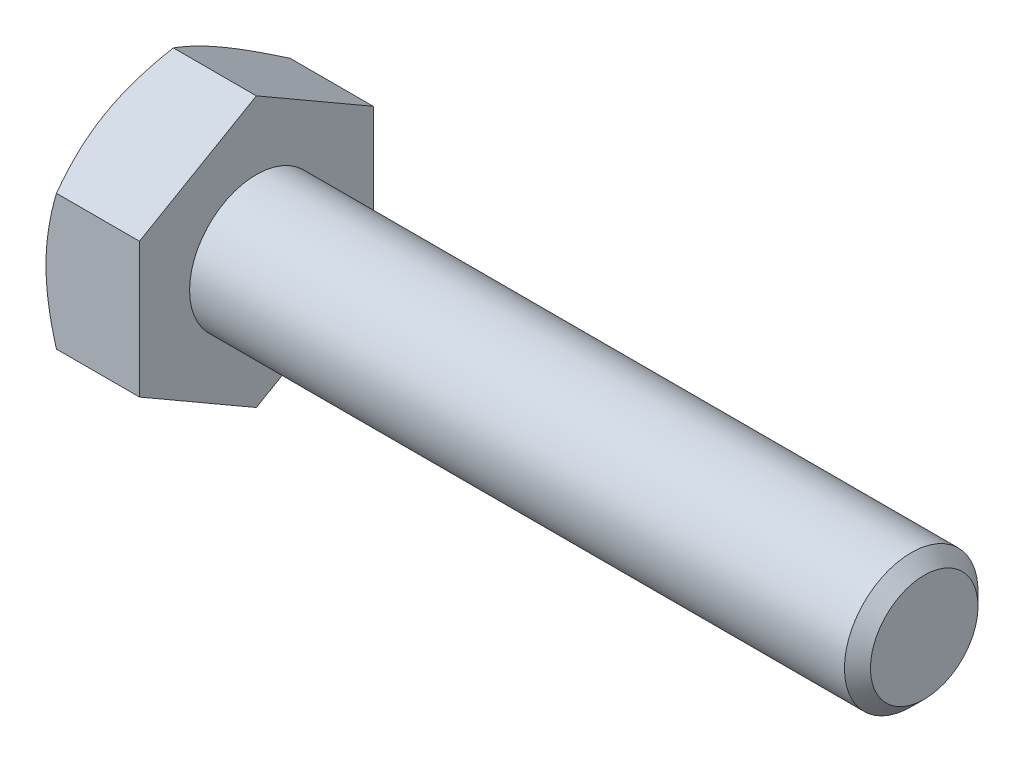
ISO-10303-21;
HEADER;
FILE_DESCRIPTION(('STEP AP214'),'2;1');
FILE_NAME('part.step','',(''),(''),'','','');
FILE_SCHEMA(('AUTOMOTIVE_DESIGN { 1 0 10303 214 1 1 1 1 }'));
ENDSEC;
DATA;
#1=APPLICATION_CONTEXT('core data for automotive mechanical design processes');
#2=APPLICATION_PROTOCOL_DEFINITION('international standard','automotive_design',2000,#1);
#3=PRODUCT_CONTEXT('',#1,'mechanical');
#4=PRODUCT('Part','Part','',(#3));
#5=PRODUCT_RELATED_PRODUCT_CATEGORY('part','',(#4));
#6=PRODUCT_DEFINITION_FORMATION('','',#4);
#7=PRODUCT_DEFINITION_CONTEXT('part definition',#1,'design');
#8=PRODUCT_DEFINITION('design','',#6,#7);
#9=PRODUCT_DEFINITION_SHAPE('','',#8);
#10=(LENGTH_UNIT() NAMED_UNIT(*) SI_UNIT(.MILLI.,.METRE.));
#11=(NAMED_UNIT(*) PLANE_ANGLE_UNIT() SI_UNIT($,.RADIAN.));
#12=(NAMED_UNIT(*) SI_UNIT($,.STERADIAN.) SOLID_ANGLE_UNIT());
#13=UNCERTAINTY_MEASURE_WITH_UNIT(LENGTH_MEASURE(1.E-05),#10,'distance_accuracy_value','');
#14=(GEOMETRIC_REPRESENTATION_CONTEXT(3) GLOBAL_UNCERTAINTY_ASSIGNED_CONTEXT((#13)) GLOBAL_UNIT_ASSIGNED_CONTEXT((#10,
#11,#12)) REPRESENTATION_CONTEXT('',''));
#15=CARTESIAN_POINT('',(0.,0.,0.));
#16=DIRECTION('',(0.,0.,1.));
#17=DIRECTION('',(1.,0.,0.));
#18=AXIS2_PLACEMENT_3D('',#15,#16,#17);
#19=CARTESIAN_POINT('',(0.,0.,-6.99999999999999));
#20=DIRECTION('',(1.,0.,0.));
#21=DIRECTION('',(0.,0.,-1.));
#22=AXIS2_PLACEMENT_3D('',#19,#20,#21);
#23=PLANE('',#22);
#24=CARTESIAN_POINT('',(0.,0.,0.));
#25=DIRECTION('',(1.,0.,0.));
#26=DIRECTION('',(0.,0.,-1.));
#27=AXIS2_PLACEMENT_3D('',#24,#25,#26);
#28=CIRCLE('',#27,3.49999999997408);
#29=CARTESIAN_POINT('',(7.48494014862193E-12,-3.03108891323431,-1.74999999999353));
#30=VERTEX_POINT('',#29);
#31=CARTESIAN_POINT('',(7.48244226857625E-12,0.,-3.49999999998704));
#32=VERTEX_POINT('',#31);
#33=EDGE_CURVE('E339',#30,#32,#28,.T.);
#34=ORIENTED_EDGE('',*,*,#33,.F.);
#35=CARTESIAN_POINT('',(0.,0.,0.));
#36=DIRECTION('',(1.,0.,0.));
#37=DIRECTION('',(0.,0.,-1.));
#38=AXIS2_PLACEMENT_3D('',#35,#36,#37);
#39=CIRCLE('',#38,3.49999999997408);
#40=CARTESIAN_POINT('',(7.48509021038975E-12,-3.03108891323431,1.74999999999353));
#41=VERTEX_POINT('',#40);
#42=EDGE_CURVE('E338',#41,#30,#39,.T.);
#43=ORIENTED_EDGE('',*,*,#42,.F.);
#44=CARTESIAN_POINT('',(0.,0.,0.));
#45=DIRECTION('',(1.,0.,0.));
#46=DIRECTION('',(0.,0.,-1.));
#47=AXIS2_PLACEMENT_3D('',#44,#45,#46);
#48=CIRCLE('',#47,3.49999999997408);
#49=CARTESIAN_POINT('',(7.4830114747167E-12,0.,3.49999999998704));
#50=VERTEX_POINT('',#49);
#51=EDGE_CURVE('E88',#50,#41,#48,.T.);
#52=ORIENTED_EDGE('',*,*,#51,.F.);
#53=CARTESIAN_POINT('',(0.,0.,0.));
#54=DIRECTION('',(1.,0.,0.));
#55=DIRECTION('',(0.,0.,-1.));
#56=AXIS2_PLACEMENT_3D('',#53,#54,#55);
#57=CIRCLE('',#56,3.49999999997408);
#58=CARTESIAN_POINT('',(7.48298017190871E-12,3.03108891323431,1.74999999999352));
#59=VERTEX_POINT('',#58);
#60=EDGE_CURVE('E86',#59,#50,#57,.T.);
#61=ORIENTED_EDGE('',*,*,#60,.F.);
#62=CARTESIAN_POINT('',(0.,0.,0.));
#63=DIRECTION('',(1.,0.,0.));
#64=DIRECTION('',(0.,0.,-1.));
#65=AXIS2_PLACEMENT_3D('',#62,#63,#64);
#66=CIRCLE('',#65,3.49999999997408);
#67=CARTESIAN_POINT('',(7.48271949116511E-12,3.03108891323431,-1.74999999999352));
#68=VERTEX_POINT('',#67);
#69=EDGE_CURVE('E19',#68,#59,#66,.T.);
#70=ORIENTED_EDGE('',*,*,#69,.F.);
#71=CARTESIAN_POINT('',(0.,0.,0.));
#72=DIRECTION('',(1.,0.,0.));
#73=DIRECTION('',(0.,0.,-1.));
#74=AXIS2_PLACEMENT_3D('',#71,#72,#73);
#75=CIRCLE('',#74,3.49999999997408);
#76=EDGE_CURVE('E264',#32,#68,#75,.T.);
#77=ORIENTED_EDGE('',*,*,#76,.F.);
#78=EDGE_LOOP('',(#34,#43,#52,#61,#70,#77));
#79=FACE_BOUND('',#78,.T.);
#80=ADVANCED_FACE('F16',(#79),#23,.F.);
#81=CARTESIAN_POINT('',(0.314483035481317,0.,0.));
#82=DIRECTION('',(1.,0.,0.));
#83=DIRECTION('',(0.,0.,-1.));
#84=AXIS2_PLACEMENT_3D('',#81,#82,#83);
#85=CONICAL_SURFACE('',#84,4.04470059555706,1.04719755120523);
#86=CARTESIAN_POINT('',(0.312607391177708,4.04145188432622,-2.01743018292338E-12));
#87=CARTESIAN_POINT('',(0.265112394132875,3.95920876897057,-0.142449254370742));
#88=CARTESIAN_POINT('',(0.221598684792665,3.8763070211927,-0.286039293558279));
#89=CARTESIAN_POINT('',(0.144863041828105,3.70977275492645,-0.574485103932631));
#90=CARTESIAN_POINT('',(0.11159021761114,3.62614604530345,-0.719330813869467));
#91=CARTESIAN_POINT('',(0.0707368384684002,3.49991674768738,-0.937966370744231));
#92=CARTESIAN_POINT('',(0.0586233956379737,3.45768086053358,-1.01112107319736));
#93=CARTESIAN_POINT('',(0.0376547735882159,3.37300688581806,-1.15778069948345));
#94=CARTESIAN_POINT('',(0.0287995086111668,3.33056880360805,-1.23128561404698));
#95=CARTESIAN_POINT('',(0.0145028291227154,3.24533346556606,-1.37891755013601));
#96=CARTESIAN_POINT('',(0.00907877549514347,3.20253547614293,-1.45304584227866));
#97=CARTESIAN_POINT('',(0.0018198533431003,3.11685532751277,-1.60144821290615));
#98=CARTESIAN_POINT('',(-1.43043546102101E-05,3.07397315331881,-1.67572231734911));
#99=CARTESIAN_POINT('',(1.49655725615464E-11,3.0310889132456,-1.74999999999989));
#100=B_SPLINE_CURVE_WITH_KNOTS('',3,(#86,#87,#88,#89,#90,#91,#92,#93,#94,#95,#96,#97,#98,#99),
.UNSPECIFIED.,.F.,.F.,(4,2,2,2,2,2,4),(0.,0.513825660872494,1.02505510268873,1.28100524354465,
1.53694864711629,1.79417690106152,2.05145608301128),.UNSPECIFIED.);
#101=CARTESIAN_POINT('',(0.312607391177708,4.04145188432622,0.));
#102=VERTEX_POINT('',#101);
#103=EDGE_CURVE('E98',#102,#68,#100,.T.);
#104=ORIENTED_EDGE('',*,*,#103,.T.);
#105=ORIENTED_EDGE('',*,*,#69,.T.);
#106=CARTESIAN_POINT('',(1.54334787669306E-11,3.03108891324483,1.7499999999996));
#107=CARTESIAN_POINT('',(-1.43043544437026E-05,3.0739731533185,1.67572231734907));
#108=CARTESIAN_POINT('',(0.00181985334314265,3.11685532751265,1.6014482129062));
#109=CARTESIAN_POINT('',(0.00907877549509426,3.20253547614296,1.45304584227877));
#110=CARTESIAN_POINT('',(0.0145028291226986,3.24533346556604,1.37891755013608));
#111=CARTESIAN_POINT('',(0.0287995086111734,3.330568803608,1.23128561404702));
#112=CARTESIAN_POINT('',(0.0376547735882136,3.37300688581803,1.1577806994835));
#113=CARTESIAN_POINT('',(0.058623395637965,3.45768086053357,1.0111210731974));
#114=CARTESIAN_POINT('',(0.070736838468394,3.49991674768737,0.937966370744262));
#115=CARTESIAN_POINT('',(0.111590217611138,3.62614604530344,0.719330813869488));
#116=CARTESIAN_POINT('',(0.144863041828101,3.70977275492643,0.574485103932652));
#117=CARTESIAN_POINT('',(0.22159868479266,3.87630702119269,0.286039293558293));
#118=CARTESIAN_POINT('',(0.265112394132871,3.95920876897057,0.142449254370751));
#119=CARTESIAN_POINT('',(0.312607391177708,4.04145188432622,2.0176973672536E-12));
#120=B_SPLINE_CURVE_WITH_KNOTS('',3,(#106,#107,#108,#109,#110,#111,#112,#113,#114,#115,#116,
#117,#118,#119),.UNSPECIFIED.,.F.,.F.,(4,2,2,2,2,2,4),(0.,0.257279181949792,0.514507435895049,
0.770450839466711,1.02640098032265,1.53763042213889,2.0514560830114),.UNSPECIFIED.);
#121=EDGE_CURVE('E96',#59,#102,#120,.T.);
#122=ORIENTED_EDGE('',*,*,#121,.T.);
#123=EDGE_LOOP('',(#104,#105,#122));
#124=FACE_BOUND('',#123,.T.);
#125=ADVANCED_FACE('F94',(#124),#85,.T.);
#126=CARTESIAN_POINT('',(0.314483035481317,0.,0.));
#127=DIRECTION('',(1.,0.,0.));
#128=DIRECTION('',(0.,0.,-1.));
#129=AXIS2_PLACEMENT_3D('',#126,#127,#128);
#130=CONICAL_SURFACE('',#129,4.04470059555706,1.04719755120523);
#131=CARTESIAN_POINT('',(0.312607391177707,2.02072594216485,3.49999999999798));
#132=CARTESIAN_POINT('',(0.265112394132874,2.1029690575205,3.35755074562926));
#133=CARTESIAN_POINT('',(0.221598684792664,2.18587080529837,3.21396070644172));
#134=CARTESIAN_POINT('',(0.144863041828104,2.35240507156462,2.92551489606737));
#135=CARTESIAN_POINT('',(0.11159021761114,2.43603178118762,2.78066918613054));
#136=CARTESIAN_POINT('',(0.0707368384684001,2.56226107880369,2.56203362925577));
#137=CARTESIAN_POINT('',(0.0586233956379736,2.60449696595749,2.48887892680264));
#138=CARTESIAN_POINT('',(0.0376547735882158,2.68917094067301,2.34221930051655));
#139=CARTESIAN_POINT('',(0.0287995086111668,2.73160902288302,2.26871438595303));
#140=CARTESIAN_POINT('',(0.0145028291227157,2.81684436092501,2.12108244986399));
#141=CARTESIAN_POINT('',(0.00907877549514398,2.85964235034814,2.04695415772134));
#142=CARTESIAN_POINT('',(0.00181985334310096,2.9453224989783,1.89855178709386));
#143=CARTESIAN_POINT('',(-1.43043546096098E-05,2.98820467317226,1.82427768265089));
#144=CARTESIAN_POINT('',(1.49657809408256E-11,3.03108891324547,1.75000000000012));
#145=B_SPLINE_CURVE_WITH_KNOTS('',3,(#131,#132,#133,#134,#135,#136,#137,#138,#139,#140,#141,
#142,#143,#144),.UNSPECIFIED.,.F.,.F.,(4,2,2,2,2,2,4),(0.,0.513825660872493,1.02505510268873,
1.28100524354464,1.53694864711629,1.79417690106152,2.05145608301127),.UNSPECIFIED.);
#146=CARTESIAN_POINT('',(0.312607391177707,2.02072594216311,3.49999999999899));
#147=VERTEX_POINT('',#146);
#148=EDGE_CURVE('E101',#147,#59,#145,.T.);
#149=ORIENTED_EDGE('',*,*,#148,.T.);
#150=ORIENTED_EDGE('',*,*,#60,.T.);
#151=CARTESIAN_POINT('',(1.5433488948791E-11,0.,3.49999999999919));
#152=CARTESIAN_POINT('',(-1.43043544435853E-05,0.0857684801464301,3.49999999999971));
#153=CARTESIAN_POINT('',(0.00181985334314281,0.17153282853437,3.49999999999992));
#154=CARTESIAN_POINT('',(0.00907877549509442,0.342893125794709,3.50000000000008));
#155=CARTESIAN_POINT('',(0.0145028291226987,0.428489104640971,3.50000000000002));
#156=CARTESIAN_POINT('',(0.0287995086111735,0.598959780724963,3.49999999999998));
#157=CARTESIAN_POINT('',(0.0376547735882136,0.683835945144989,3.5));
#158=CARTESIAN_POINT('',(0.0586233956379648,0.853183894576052,3.50000000000001));
#159=CARTESIAN_POINT('',(0.0707368384683937,0.937655668883661,3.5));
#160=CARTESIAN_POINT('',(0.111590217611137,1.19011426411581,3.5));
#161=CARTESIAN_POINT('',(0.1448630418281,1.3573676833618,3.5));
#162=CARTESIAN_POINT('',(0.221598684792659,1.69043621589431,3.5));
#163=CARTESIAN_POINT('',(0.265112394132869,1.85623971145006,3.50000000000001));
#164=CARTESIAN_POINT('',(0.312607391177707,2.02072594216136,3.5));
#165=B_SPLINE_CURVE_WITH_KNOTS('',3,(#151,#152,#153,#154,#155,#156,#157,#158,#159,#160,#161,
#162,#163,#164),.UNSPECIFIED.,.F.,.F.,(4,2,2,2,2,2,4),(0.,0.257279181949791,0.514507435895047,
0.770450839466708,1.02640098032264,1.53763042213888,2.0514560830114),.UNSPECIFIED.);
#166=EDGE_CURVE('E104',#50,#147,#165,.T.);
#167=ORIENTED_EDGE('',*,*,#166,.T.);
#168=EDGE_LOOP('',(#149,#150,#167));
#169=FACE_BOUND('',#168,.T.);
#170=ADVANCED_FACE('F102',(#169),#130,.T.);
#171=CARTESIAN_POINT('',(0.314483035481317,0.,0.));
#172=DIRECTION('',(1.,0.,0.));
#173=DIRECTION('',(0.,0.,-1.));
#174=AXIS2_PLACEMENT_3D('',#171,#172,#173);
#175=CONICAL_SURFACE('',#174,4.04470059555706,1.04719755120523);
#176=ORIENTED_EDGE('',*,*,#51,.T.);
#177=CARTESIAN_POINT('',(1.54388080711888E-11,-3.03108891324484,1.7499999999996));
#178=CARTESIAN_POINT('',(-1.43043544394599E-05,-2.98820467317207,1.82427768265065));
#179=CARTESIAN_POINT('',(0.00181985334314658,-2.94532249897829,1.89855178709373));
#180=CARTESIAN_POINT('',(0.00907877549509805,-2.85964235034825,2.04695415772132));
#181=CARTESIAN_POINT('',(0.0145028291227026,-2.81684436092507,2.12108244986395));
#182=CARTESIAN_POINT('',(0.0287995086111772,-2.73160902288304,2.26871438595297));
#183=CARTESIAN_POINT('',(0.037654773588217,-2.68917094067304,2.34221930051651));
#184=CARTESIAN_POINT('',(0.0586233956379681,-2.60449696595752,2.48887892680261));
#185=CARTESIAN_POINT('',(0.0707368384683971,-2.56226107880371,2.56203362925575));
#186=CARTESIAN_POINT('',(0.111590217611141,-2.43603178118763,2.78066918613051));
#187=CARTESIAN_POINT('',(0.144863041828103,-2.35240507156464,2.92551489606735));
#188=CARTESIAN_POINT('',(0.221598684792661,-2.18587080529839,3.21396070644171));
#189=CARTESIAN_POINT('',(0.265112394132872,-2.10296905752051,3.35755074562926));
#190=CARTESIAN_POINT('',(0.312607391177709,-2.02072594216486,3.49999999999798));
#191=B_SPLINE_CURVE_WITH_KNOTS('',3,(#177,#178,#179,#180,#181,#182,#183,#184,#185,#186,#187,
#188,#189,#190),.UNSPECIFIED.,.F.,.F.,(4,2,2,2,2,2,4),(0.,0.25727918194979,0.514507435895046,
0.770450839466706,1.02640098032264,1.53763042213888,2.05145608301139),.UNSPECIFIED.);
#192=CARTESIAN_POINT('',(0.312607391177709,-2.02072594216311,3.49999999999899));
#193=VERTEX_POINT('',#192);
#194=EDGE_CURVE('E179',#41,#193,#191,.T.);
#195=ORIENTED_EDGE('',*,*,#194,.T.);
#196=CARTESIAN_POINT('',(0.312607391177709,-2.02072594216137,3.5));
#197=CARTESIAN_POINT('',(0.265112394132876,-1.85623971145008,3.5));
#198=CARTESIAN_POINT('',(0.221598684792666,-1.69043621589433,3.5));
#199=CARTESIAN_POINT('',(0.144863041828105,-1.35736768336183,3.5));
#200=CARTESIAN_POINT('',(0.111590217611141,-1.19011426411584,3.5));
#201=CARTESIAN_POINT('',(0.0707368384684006,-0.937655668883699,3.5));
#202=CARTESIAN_POINT('',(0.0586233956379741,-0.853183894576097,3.5));
#203=CARTESIAN_POINT('',(0.0376547735882162,-0.683835945145044,3.5));
#204=CARTESIAN_POINT('',(0.0287995086111671,-0.598959780725022,3.5));
#205=CARTESIAN_POINT('',(0.0145028291227158,-0.428489104641043,3.5));
#206=CARTESIAN_POINT('',(0.00907877549514402,-0.342893125794789,3.5));
#207=CARTESIAN_POINT('',(0.00181985334310095,-0.171532828534472,3.5));
#208=CARTESIAN_POINT('',(-1.43043546095876E-05,-0.0857684801465466,3.5));
#209=CARTESIAN_POINT('',(1.49659687393248E-11,-1.34741464069295E-13,3.5));
#210=B_SPLINE_CURVE_WITH_KNOTS('',3,(#196,#197,#198,#199,#200,#201,#202,#203,#204,#205,#206,
#207,#208,#209),.UNSPECIFIED.,.F.,.F.,(4,2,2,2,2,2,4),(0.,0.513825660872494,1.02505510268873,
1.28100524354465,1.53694864711629,1.79417690106153,2.05145608301128),.UNSPECIFIED.);
#211=EDGE_CURVE('E151',#193,#50,#210,.T.);
#212=ORIENTED_EDGE('',*,*,#211,.T.);
#213=EDGE_LOOP('',(#176,#195,#212));
#214=FACE_BOUND('',#213,.T.);
#215=ADVANCED_FACE('F141',(#214),#175,.T.);
#216=CARTESIAN_POINT('',(0.314483035481317,0.,0.));
#217=DIRECTION('',(1.,0.,0.));
#218=DIRECTION('',(0.,0.,-1.));
#219=AXIS2_PLACEMENT_3D('',#216,#217,#218);
#220=CONICAL_SURFACE('',#219,4.04470059555706,1.04719755120523);
#221=ORIENTED_EDGE('',*,*,#42,.T.);
#222=CARTESIAN_POINT('',(1.54375912977579E-11,-3.03108891324484,-1.7499999999996));
#223=CARTESIAN_POINT('',(-1.43043544404507E-05,-3.0739731533185,-1.67572231734907));
#224=CARTESIAN_POINT('',(0.00181985334314582,-3.11685532751266,-1.6014482129062));
#225=CARTESIAN_POINT('',(0.0090787754950977,-3.20253547614296,-1.45304584227877));
#226=CARTESIAN_POINT('',(0.0145028291227024,-3.24533346556604,-1.37891755013609));
#227=CARTESIAN_POINT('',(0.0287995086111773,-3.33056880360801,-1.23128561404702));
#228=CARTESIAN_POINT('',(0.0376547735882171,-3.37300688581803,-1.1577806994835));
#229=CARTESIAN_POINT('',(0.0586233956379686,-3.45768086053357,-1.0111210731974));
#230=CARTESIAN_POINT('',(0.070736838468398,-3.49991674768738,-0.937966370744264));
#231=CARTESIAN_POINT('',(0.111590217611142,-3.62614604530344,-0.71933081386949));
#232=CARTESIAN_POINT('',(0.144863041828105,-3.70977275492644,-0.574485103932653));
#233=CARTESIAN_POINT('',(0.221598684792664,-3.8763070211927,-0.286039293558293));
#234=CARTESIAN_POINT('',(0.265112394132875,-3.95920876897058,-0.14244925437075));
#235=CARTESIAN_POINT('',(0.312607391177713,-4.04145188432623,-2.01664207061729E-12));
#236=B_SPLINE_CURVE_WITH_KNOTS('',3,(#222,#223,#224,#225,#226,#227,#228,#229,#230,#231,#232,
#233,#234,#235),.UNSPECIFIED.,.F.,.F.,(4,2,2,2,2,2,4),(0.,0.257279181949793,0.514507435895051,
0.770450839466714,1.02640098032265,1.53763042213889,2.05145608301141),.UNSPECIFIED.);
#237=CARTESIAN_POINT('',(0.312607391177713,-4.04145188432623,0.));
#238=VERTEX_POINT('',#237);
#239=EDGE_CURVE('E311',#30,#238,#236,.T.);
#240=ORIENTED_EDGE('',*,*,#239,.T.);
#241=CARTESIAN_POINT('',(0.312607391177713,-4.04145188432623,2.01780026656131E-12));
#242=CARTESIAN_POINT('',(0.26511239413288,-3.95920876897058,0.142449254370743));
#243=CARTESIAN_POINT('',(0.22159868479267,-3.87630702119271,0.28603929355828));
#244=CARTESIAN_POINT('',(0.144863041828109,-3.70977275492646,0.574485103932633));
#245=CARTESIAN_POINT('',(0.111590217611145,-3.62614604530346,0.719330813869469));
#246=CARTESIAN_POINT('',(0.0707368384684048,-3.49991674768739,0.937966370744233));
#247=CARTESIAN_POINT('',(0.0586233956379782,-3.45768086053359,1.01112107319736));
#248=CARTESIAN_POINT('',(0.0376547735882204,-3.37300688581806,1.15778069948346));
#249=CARTESIAN_POINT('',(0.0287995086111713,-3.33056880360805,1.23128561404698));
#250=CARTESIAN_POINT('',(0.01450282912272,-3.24533346556606,1.37891755013602));
#251=CARTESIAN_POINT('',(0.00907877549514811,-3.20253547614294,1.45304584227867));
#252=CARTESIAN_POINT('',(0.00181985334310488,-3.11685532751278,1.60144821290615));
#253=CARTESIAN_POINT('',(-1.43043546057029E-05,-3.07397315331881,1.67572231734912));
#254=CARTESIAN_POINT('',(1.49699093702364E-11,-3.03108891324561,1.74999999999989));
#255=B_SPLINE_CURVE_WITH_KNOTS('',3,(#241,#242,#243,#244,#245,#246,#247,#248,#249,#250,#251,
#252,#253,#254),.UNSPECIFIED.,.F.,.F.,(4,2,2,2,2,2,4),(0.,0.513825660872495,1.02505510268873,
1.28100524354465,1.5369486471163,1.79417690106153,2.05145608301128),.UNSPECIFIED.);
#256=EDGE_CURVE('E173',#238,#41,#255,.T.);
#257=ORIENTED_EDGE('',*,*,#256,.T.);
#258=EDGE_LOOP('',(#221,#240,#257));
#259=FACE_BOUND('',#258,.T.);
#260=ADVANCED_FACE('F329',(#259),#220,.T.);
#261=CARTESIAN_POINT('',(0.314483035481317,0.,0.));
#262=DIRECTION('',(1.,0.,0.));
#263=DIRECTION('',(0.,0.,-1.));
#264=AXIS2_PLACEMENT_3D('',#261,#262,#263);
#265=CONICAL_SURFACE('',#264,4.04470059555706,1.04719755120523);
#266=ORIENTED_EDGE('',*,*,#33,.T.);
#267=CARTESIAN_POINT('',(1.54324609377126E-11,0.,-3.49999999999919));
#268=CARTESIAN_POINT('',(-1.43043544445639E-05,-0.0857684801464338,-3.49999999999971));
#269=CARTESIAN_POINT('',(0.00181985334314196,-0.171532828534378,-3.49999999999992));
#270=CARTESIAN_POINT('',(0.00907877549509407,-0.342893125794724,-3.50000000000008));
#271=CARTESIAN_POINT('',(0.0145028291226988,-0.428489104640989,-3.50000000000002));
#272=CARTESIAN_POINT('',(0.0287995086111746,-0.598959780724988,-3.49999999999998));
#273=CARTESIAN_POINT('',(0.0376547735882155,-0.683835945145018,-3.49999999999999));
#274=CARTESIAN_POINT('',(0.0586233956379685,-0.853183894576088,-3.5));
#275=CARTESIAN_POINT('',(0.0707368384683985,-0.9376556688837,-3.5));
#276=CARTESIAN_POINT('',(0.111590217611145,-1.19011426411586,-3.49999999999999));
#277=CARTESIAN_POINT('',(0.144863041828111,-1.35736768336185,-3.5));
#278=CARTESIAN_POINT('',(0.221598684792675,-1.69043621589438,-3.5));
#279=CARTESIAN_POINT('',(0.265112394132889,-1.85623971145014,-3.5));
#280=CARTESIAN_POINT('',(0.312607391177729,-2.02072594216144,-3.5));
#281=B_SPLINE_CURVE_WITH_KNOTS('',3,(#267,#268,#269,#270,#271,#272,#273,#274,#275,#276,#277,
#278,#279,#280),.UNSPECIFIED.,.F.,.F.,(4,2,2,2,2,2,4),(0.,0.257279181949802,0.514507435895069,
0.770450839466741,1.02640098032269,1.53763042213895,2.05145608301148),.UNSPECIFIED.);
#282=CARTESIAN_POINT('',(0.312607391177704,-2.02072594216318,-3.49999999999895));
#283=VERTEX_POINT('',#282);
#284=EDGE_CURVE('E240',#32,#283,#281,.T.);
#285=ORIENTED_EDGE('',*,*,#284,.T.);
#286=CARTESIAN_POINT('',(0.312607391177677,-2.02072594216491,-3.49999999999789));
#287=CARTESIAN_POINT('',(0.265112394132849,-2.10296905752055,-3.35755074562918));
#288=CARTESIAN_POINT('',(0.221598684792644,-2.18587080529842,-3.21396070644165));
#289=CARTESIAN_POINT('',(0.144863041828092,-2.35240507156466,-2.92551489606731));
#290=CARTESIAN_POINT('',(0.111590217611131,-2.43603178118765,-2.78066918613048));
#291=CARTESIAN_POINT('',(0.0707368384683956,-2.56226107880372,-2.56203362925573));
#292=CARTESIAN_POINT('',(0.0586233956379703,-2.60449696595751,-2.48887892680261));
#293=CARTESIAN_POINT('',(0.037654773588215,-2.68917094067304,-2.34221930051652));
#294=CARTESIAN_POINT('',(0.0287995086111672,-2.73160902288304,-2.268714385953));
#295=CARTESIAN_POINT('',(0.0145028291227177,-2.81684436092503,-2.12108244986398));
#296=CARTESIAN_POINT('',(0.00907877549514635,-2.85964235034815,-2.04695415772133));
#297=CARTESIAN_POINT('',(0.00181985334310392,-2.94532249897831,-1.89855178709385));
#298=CARTESIAN_POINT('',(-1.43043546064518E-05,-2.98820467317227,-1.82427768265089));
#299=CARTESIAN_POINT('',(1.49693381961576E-11,-3.03108891324547,-1.75000000000013));
#300=B_SPLINE_CURVE_WITH_KNOTS('',3,(#286,#287,#288,#289,#290,#291,#292,#293,#294,#295,#296,
#297,#298,#299),.UNSPECIFIED.,.F.,.F.,(4,2,2,2,2,2,4),(0.,0.513825660872464,1.02505510268867,
1.28100524354457,1.5369486471162,1.79417690106142,2.05145608301116),.UNSPECIFIED.);
#301=EDGE_CURVE('E310',#283,#30,#300,.T.);
#302=ORIENTED_EDGE('',*,*,#301,.T.);
#303=EDGE_LOOP('',(#266,#285,#302));
#304=FACE_BOUND('',#303,.T.);
#305=ADVANCED_FACE('F255',(#304),#265,.T.);
#306=CARTESIAN_POINT('',(0.314483035481317,0.,0.));
#307=DIRECTION('',(1.,0.,0.));
#308=DIRECTION('',(0.,0.,-1.));
#309=AXIS2_PLACEMENT_3D('',#306,#307,#308);
#310=CONICAL_SURFACE('',#309,4.04470059555706,1.04719755120523);
#311=CARTESIAN_POINT('',(0.312607391177706,2.02072594216136,-3.5));
#312=CARTESIAN_POINT('',(0.265112394132873,1.85623971145007,-3.5));
#313=CARTESIAN_POINT('',(0.221598684792663,1.69043621589432,-3.5));
#314=CARTESIAN_POINT('',(0.144863041828103,1.35736768336182,-3.5));
#315=CARTESIAN_POINT('',(0.111590217611139,1.19011426411583,-3.5));
#316=CARTESIAN_POINT('',(0.070736838468399,0.937655668883696,-3.5));
#317=CARTESIAN_POINT('',(0.0586233956379725,0.853183894576093,-3.5));
#318=CARTESIAN_POINT('',(0.0376547735882147,0.683835945145042,-3.5));
#319=CARTESIAN_POINT('',(0.0287995086111657,0.59895978072502,-3.5));
#320=CARTESIAN_POINT('',(0.0145028291227146,0.428489104641041,-3.5));
#321=CARTESIAN_POINT('',(0.00907877549514288,0.342893125794788,-3.5));
#322=CARTESIAN_POINT('',(0.00181985334309992,0.171532828534472,-3.5));
#323=CARTESIAN_POINT('',(-1.43043546106091E-05,0.0857684801465465,-3.5));
#324=CARTESIAN_POINT('',(1.49648303270439E-11,1.34863727982184E-13,-3.5));
#325=B_SPLINE_CURVE_WITH_KNOTS('',3,(#311,#312,#313,#314,#315,#316,#317,#318,#319,#320,#321,
#322,#323,#324),.UNSPECIFIED.,.F.,.F.,(4,2,2,2,2,2,4),(0.,0.513825660872493,1.02505510268873,
1.28100524354464,1.53694864711629,1.79417690106152,2.05145608301127),.UNSPECIFIED.);
#326=CARTESIAN_POINT('',(0.312607391178042,2.02072594216427,-3.49999999999899));
#327=VERTEX_POINT('',#326);
#328=EDGE_CURVE('E231',#327,#32,#325,.T.);
#329=ORIENTED_EDGE('',*,*,#328,.T.);
#330=ORIENTED_EDGE('',*,*,#76,.T.);
#331=CARTESIAN_POINT('',(1.5433374238824E-11,3.03108891324483,-1.7499999999996));
#332=CARTESIAN_POINT('',(-1.43043544440094E-05,2.98820467317207,-1.82427768265065));
#333=CARTESIAN_POINT('',(0.00181985334314227,2.94532249897828,-1.89855178709373));
#334=CARTESIAN_POINT('',(0.00907877549509376,2.85964235034825,-2.04695415772131));
#335=CARTESIAN_POINT('',(0.0145028291226981,2.81684436092507,-2.12108244986394));
#336=CARTESIAN_POINT('',(0.0287995086111727,2.73160902288303,-2.26871438595297));
#337=CARTESIAN_POINT('',(0.0376547735882128,2.68917094067303,-2.3422193005165));
#338=CARTESIAN_POINT('',(0.058623395637964,2.60449696595751,-2.48887892680261));
#339=CARTESIAN_POINT('',(0.070736838468393,2.5622610788037,-2.56203362925574));
#340=CARTESIAN_POINT('',(0.111590217611137,2.43603178118763,-2.78066918613051));
#341=CARTESIAN_POINT('',(0.144863041828099,2.35240507156463,-2.92551489606735));
#342=CARTESIAN_POINT('',(0.221598684792658,2.18587080529838,-3.21396070644171));
#343=CARTESIAN_POINT('',(0.265112394132868,2.1029690575205,-3.35755074562925));
#344=CARTESIAN_POINT('',(0.312607391177706,2.02072594216485,-3.49999999999798));
#345=B_SPLINE_CURVE_WITH_KNOTS('',3,(#331,#332,#333,#334,#335,#336,#337,#338,#339,#340,#341,
#342,#343,#344),.UNSPECIFIED.,.F.,.F.,(4,2,2,2,2,2,4),(0.,0.257279181949791,0.514507435895046,
0.770450839466708,1.02640098032264,1.53763042213888,2.0514560830114),.UNSPECIFIED.);
#346=EDGE_CURVE('E114',#68,#327,#345,.T.);
#347=ORIENTED_EDGE('',*,*,#346,.T.);
#348=EDGE_LOOP('',(#329,#330,#347));
#349=FACE_BOUND('',#348,.T.);
#350=ADVANCED_FACE('F250',(#349),#310,.T.);
#351=CARTESIAN_POINT('',(22.8,0.,0.));
#352=DIRECTION('',(-1.,0.,0.));
#353=DIRECTION('',(0.,0.,1.));
#354=AXIS2_PLACEMENT_3D('',#351,#352,#353);
#355=PLANE('',#354);
#356=CARTESIAN_POINT('',(22.8000000000179,0.,0.));
#357=DIRECTION('',(-1.,0.,0.));
#358=DIRECTION('',(0.,0.,1.));
#359=AXIS2_PLACEMENT_3D('',#356,#357,#358);
#360=CIRCLE('',#359,1.61000000002787);
#361=CARTESIAN_POINT('',(22.8000000000179,0.,1.61000000002787));
#362=VERTEX_POINT('',#361);
#363=EDGE_CURVE('E202',#362,#362,#360,.T.);
#364=ORIENTED_EDGE('',*,*,#363,.F.);
#365=EDGE_LOOP('',(#364));
#366=FACE_BOUND('',#365,.T.);
#367=ADVANCED_FACE('F254',(#366),#355,.F.);
#368=CARTESIAN_POINT('',(2.8,2.02072594216369,-3.5));
#369=DIRECTION('',(0.,-0.866025403784438,0.500000000000001));
#370=DIRECTION('',(0.,-0.500000000000001,-0.866025403784438));
#371=AXIS2_PLACEMENT_3D('',#368,#369,#370);
#372=PLANE('',#371);
#373=DIRECTION('',(1.,0.,0.));
#374=VECTOR('',#373,1.);
#375=CARTESIAN_POINT('',(2.8,4.04145188432738,0.));
#376=LINE('',#375,#374);
#377=CARTESIAN_POINT('',(2.8,4.04145188432738,0.));
#378=VERTEX_POINT('',#377);
#379=EDGE_CURVE('E107',#102,#378,#376,.T.);
#380=ORIENTED_EDGE('',*,*,#379,.T.);
#381=DIRECTION('',(0.,0.500000000000001,0.866025403784438));
#382=VECTOR('',#381,1.);
#383=CARTESIAN_POINT('',(2.8,2.02072594216369,-3.5));
#384=LINE('',#383,#382);
#385=CARTESIAN_POINT('',(2.8,2.02072594216369,-3.5));
#386=VERTEX_POINT('',#385);
#387=EDGE_CURVE('E198',#386,#378,#384,.T.);
#388=ORIENTED_EDGE('',*,*,#387,.F.);
#389=DIRECTION('',(1.,0.,0.));
#390=VECTOR('',#389,1.);
#391=CARTESIAN_POINT('',(2.8,2.02072594216369,-3.5));
#392=LINE('',#391,#390);
#393=EDGE_CURVE('E239',#386,#327,#392,.F.);
#394=ORIENTED_EDGE('',*,*,#393,.T.);
#395=ORIENTED_EDGE('',*,*,#346,.F.);
#396=ORIENTED_EDGE('',*,*,#103,.F.);
#397=EDGE_LOOP('',(#380,#388,#394,#395,#396));
#398=FACE_BOUND('',#397,.T.);
#399=ADVANCED_FACE('F266',(#398),#372,.F.);
#400=CARTESIAN_POINT('',(2.8,4.04145188432738,0.));
#401=DIRECTION('',(0.,-0.866025403784438,-0.500000000000001));
#402=DIRECTION('',(0.,0.500000000000001,-0.866025403784438));
#403=AXIS2_PLACEMENT_3D('',#400,#401,#402);
#404=PLANE('',#403);
#405=DIRECTION('',(1.,0.,0.));
#406=VECTOR('',#405,1.);
#407=CARTESIAN_POINT('',(2.8,2.02072594216369,3.5));
#408=LINE('',#407,#406);
#409=CARTESIAN_POINT('',(2.8,2.02072594216369,3.5));
#410=VERTEX_POINT('',#409);
#411=EDGE_CURVE('E150',#147,#410,#408,.T.);
#412=ORIENTED_EDGE('',*,*,#411,.T.);
#413=DIRECTION('',(0.,-0.500000000000001,0.866025403784438));
#414=VECTOR('',#413,1.);
#415=CARTESIAN_POINT('',(2.8,4.04145188432738,0.));
#416=LINE('',#415,#414);
#417=EDGE_CURVE('E201',#378,#410,#416,.T.);
#418=ORIENTED_EDGE('',*,*,#417,.F.);
#419=ORIENTED_EDGE('',*,*,#379,.F.);
#420=ORIENTED_EDGE('',*,*,#121,.F.);
#421=ORIENTED_EDGE('',*,*,#148,.F.);
#422=EDGE_LOOP('',(#412,#418,#419,#420,#421));
#423=FACE_BOUND('',#422,.T.);
#424=ADVANCED_FACE('F110',(#423),#404,.F.);
#425=CARTESIAN_POINT('',(2.8,2.02072594216369,3.5));
#426=DIRECTION('',(0.,0.,-1.));
#427=DIRECTION('',(0.,1.,0.));
#428=AXIS2_PLACEMENT_3D('',#425,#426,#427);
#429=PLANE('',#428);
#430=DIRECTION('',(1.,0.,0.));
#431=VECTOR('',#430,1.);
#432=CARTESIAN_POINT('',(2.8,-2.0207259421637,3.5));
#433=LINE('',#432,#431);
#434=CARTESIAN_POINT('',(2.8,-2.0207259421637,3.5));
#435=VERTEX_POINT('',#434);
#436=EDGE_CURVE('E184',#193,#435,#433,.T.);
#437=ORIENTED_EDGE('',*,*,#436,.T.);
#438=DIRECTION('',(0.,1.,0.));
#439=VECTOR('',#438,1.);
#440=CARTESIAN_POINT('',(2.8,0.,3.5));
#441=LINE('',#440,#439);
#442=EDGE_CURVE('E218',#410,#435,#441,.F.);
#443=ORIENTED_EDGE('',*,*,#442,.F.);
#444=ORIENTED_EDGE('',*,*,#411,.F.);
#445=ORIENTED_EDGE('',*,*,#166,.F.);
#446=ORIENTED_EDGE('',*,*,#211,.F.);
#447=EDGE_LOOP('',(#437,#443,#444,#445,#446));
#448=FACE_BOUND('',#447,.T.);
#449=ADVANCED_FACE('F157',(#448),#429,.F.);
#450=CARTESIAN_POINT('',(2.8,-4.04145188432739,0.));
#451=DIRECTION('',(0.,0.866025403784438,-0.500000000000001));
#452=DIRECTION('',(0.,0.500000000000001,0.866025403784438));
#453=AXIS2_PLACEMENT_3D('',#450,#451,#452);
#454=PLANE('',#453);
#455=DIRECTION('',(1.,0.,0.));
#456=VECTOR('',#455,1.);
#457=CARTESIAN_POINT('',(2.8,-4.04145188432739,0.));
#458=LINE('',#457,#456);
#459=CARTESIAN_POINT('',(2.8,-4.04145188432739,0.));
#460=VERTEX_POINT('',#459);
#461=EDGE_CURVE('E308',#238,#460,#458,.T.);
#462=ORIENTED_EDGE('',*,*,#461,.T.);
#463=DIRECTION('',(0.,-0.500000000000001,-0.866025403784438));
#464=VECTOR('',#463,1.);
#465=CARTESIAN_POINT('',(2.8,-2.0207259421637,3.5));
#466=LINE('',#465,#464);
#467=EDGE_CURVE('E213',#435,#460,#466,.T.);
#468=ORIENTED_EDGE('',*,*,#467,.F.);
#469=ORIENTED_EDGE('',*,*,#436,.F.);
#470=ORIENTED_EDGE('',*,*,#194,.F.);
#471=ORIENTED_EDGE('',*,*,#256,.F.);
#472=EDGE_LOOP('',(#462,#468,#469,#470,#471));
#473=FACE_BOUND('',#472,.T.);
#474=ADVANCED_FACE('F161',(#473),#454,.F.);
#475=CARTESIAN_POINT('',(2.8,-2.02072594216369,-3.5));
#476=DIRECTION('',(0.,0.866025403784438,0.500000000000001));
#477=DIRECTION('',(0.,-0.500000000000001,0.866025403784438));
#478=AXIS2_PLACEMENT_3D('',#475,#476,#477);
#479=PLANE('',#478);
#480=DIRECTION('',(1.,0.,0.));
#481=VECTOR('',#480,1.);
#482=CARTESIAN_POINT('',(2.8,-2.02072594216386,-3.5));
#483=LINE('',#482,#481);
#484=CARTESIAN_POINT('',(2.8,-2.0207259421638,-3.5));
#485=VERTEX_POINT('',#484);
#486=EDGE_CURVE('E34',#283,#485,#483,.T.);
#487=ORIENTED_EDGE('',*,*,#486,.T.);
#488=DIRECTION('',(0.,0.500000000000002,-0.866025403784438));
#489=VECTOR('',#488,1.);
#490=CARTESIAN_POINT('',(2.8,-4.04145188432739,0.));
#491=LINE('',#490,#489);
#492=EDGE_CURVE('E208',#460,#485,#491,.T.);
#493=ORIENTED_EDGE('',*,*,#492,.F.);
#494=ORIENTED_EDGE('',*,*,#461,.F.);
#495=ORIENTED_EDGE('',*,*,#239,.F.);
#496=ORIENTED_EDGE('',*,*,#301,.F.);
#497=EDGE_LOOP('',(#487,#493,#494,#495,#496));
#498=FACE_BOUND('',#497,.T.);
#499=ADVANCED_FACE('F167',(#498),#479,.F.);
#500=CARTESIAN_POINT('',(2.8,2.02072594216369,-3.5));
#501=DIRECTION('',(0.,0.,1.));
#502=DIRECTION('',(1.,0.,0.));
#503=AXIS2_PLACEMENT_3D('',#500,#501,#502);
#504=PLANE('',#503);
#505=ORIENTED_EDGE('',*,*,#393,.F.);
#506=DIRECTION('',(0.,1.,0.));
#507=VECTOR('',#506,1.);
#508=CARTESIAN_POINT('',(2.8,0.,-3.5));
#509=LINE('',#508,#507);
#510=EDGE_CURVE('E205',#485,#386,#509,.T.);
#511=ORIENTED_EDGE('',*,*,#510,.F.);
#512=ORIENTED_EDGE('',*,*,#486,.F.);
#513=ORIENTED_EDGE('',*,*,#284,.F.);
#514=ORIENTED_EDGE('',*,*,#328,.F.);
#515=EDGE_LOOP('',(#505,#511,#512,#513,#514));
#516=FACE_BOUND('',#515,.T.);
#517=ADVANCED_FACE('F247',(#516),#504,.F.);
#518=CARTESIAN_POINT('',(22.4100000002068,0.,0.));
#519=DIRECTION('',(-1.,0.,0.));
#520=DIRECTION('',(0.,0.,1.));
#521=AXIS2_PLACEMENT_3D('',#518,#519,#520);
#522=CONICAL_SURFACE('',#521,1.99999999989586,0.785398163470325);
#523=CARTESIAN_POINT('',(22.41,0.,0.));
#524=DIRECTION('',(-1.,0.,0.));
#525=DIRECTION('',(0.,0.,1.));
#526=AXIS2_PLACEMENT_3D('',#523,#524,#525);
#527=CIRCLE('',#526,2.);
#528=CARTESIAN_POINT('',(22.41,0.,2.));
#529=VERTEX_POINT('',#528);
#530=EDGE_CURVE('E25',#529,#529,#527,.T.);
#531=ORIENTED_EDGE('',*,*,#530,.F.);
#532=EDGE_LOOP('',(#531));
#533=FACE_BOUND('',#532,.T.);
#534=ORIENTED_EDGE('',*,*,#363,.T.);
#535=EDGE_LOOP('',(#534));
#536=FACE_BOUND('',#535,.T.);
#537=ADVANCED_FACE('F285',(#533,#536),#522,.T.);
#538=CARTESIAN_POINT('',(2.8,0.,-6.99999999999999));
#539=DIRECTION('',(1.,0.,0.));
#540=DIRECTION('',(0.,0.,-1.));
#541=AXIS2_PLACEMENT_3D('',#538,#539,#540);
#542=PLANE('',#541);
#543=CARTESIAN_POINT('',(2.8,0.,0.));
#544=DIRECTION('',(-1.,0.,0.));
#545=DIRECTION('',(0.,0.,1.));
#546=AXIS2_PLACEMENT_3D('',#543,#544,#545);
#547=CIRCLE('',#546,2.);
#548=CARTESIAN_POINT('',(2.8,0.,2.));
#549=VERTEX_POINT('',#548);
#550=EDGE_CURVE('E11',#549,#549,#547,.F.);
#551=ORIENTED_EDGE('',*,*,#550,.F.);
#552=EDGE_LOOP('',(#551));
#553=FACE_BOUND('',#552,.T.);
#554=ORIENTED_EDGE('',*,*,#492,.T.);
#555=ORIENTED_EDGE('',*,*,#510,.T.);
#556=ORIENTED_EDGE('',*,*,#387,.T.);
#557=ORIENTED_EDGE('',*,*,#417,.T.);
#558=ORIENTED_EDGE('',*,*,#442,.T.);
#559=ORIENTED_EDGE('',*,*,#467,.T.);
#560=EDGE_LOOP('',(#554,#555,#556,#557,#558,#559));
#561=FACE_BOUND('',#560,.T.);
#562=ADVANCED_FACE('F279',(#553,#561),#542,.T.);
#563=CARTESIAN_POINT('',(0.,0.,0.));
#564=DIRECTION('',(-1.,0.,0.));
#565=DIRECTION('',(0.,0.,1.));
#566=AXIS2_PLACEMENT_3D('',#563,#564,#565);
#567=CYLINDRICAL_SURFACE('',#566,2.);
#568=ORIENTED_EDGE('',*,*,#550,.T.);
#569=EDGE_LOOP('',(#568));
#570=FACE_BOUND('',#569,.T.);
#571=ORIENTED_EDGE('',*,*,#530,.T.);
#572=EDGE_LOOP('',(#571));
#573=FACE_BOUND('',#572,.T.);
#574=ADVANCED_FACE('F277',(#570,#573),#567,.T.);
#575=CLOSED_SHELL('',(#80,#125,#170,#215,#260,#305,#350,#367,#399,#424,#449,#474,#499,#517,#537,
#562,#574));
#576=MANIFOLD_SOLID_BREP('B1',#575);
#577=ADVANCED_BREP_SHAPE_REPRESENTATION('',(#18,#576),#14);
#578=SHAPE_DEFINITION_REPRESENTATION(#9,#577);
ENDSEC;
END-ISO-10303-21;
